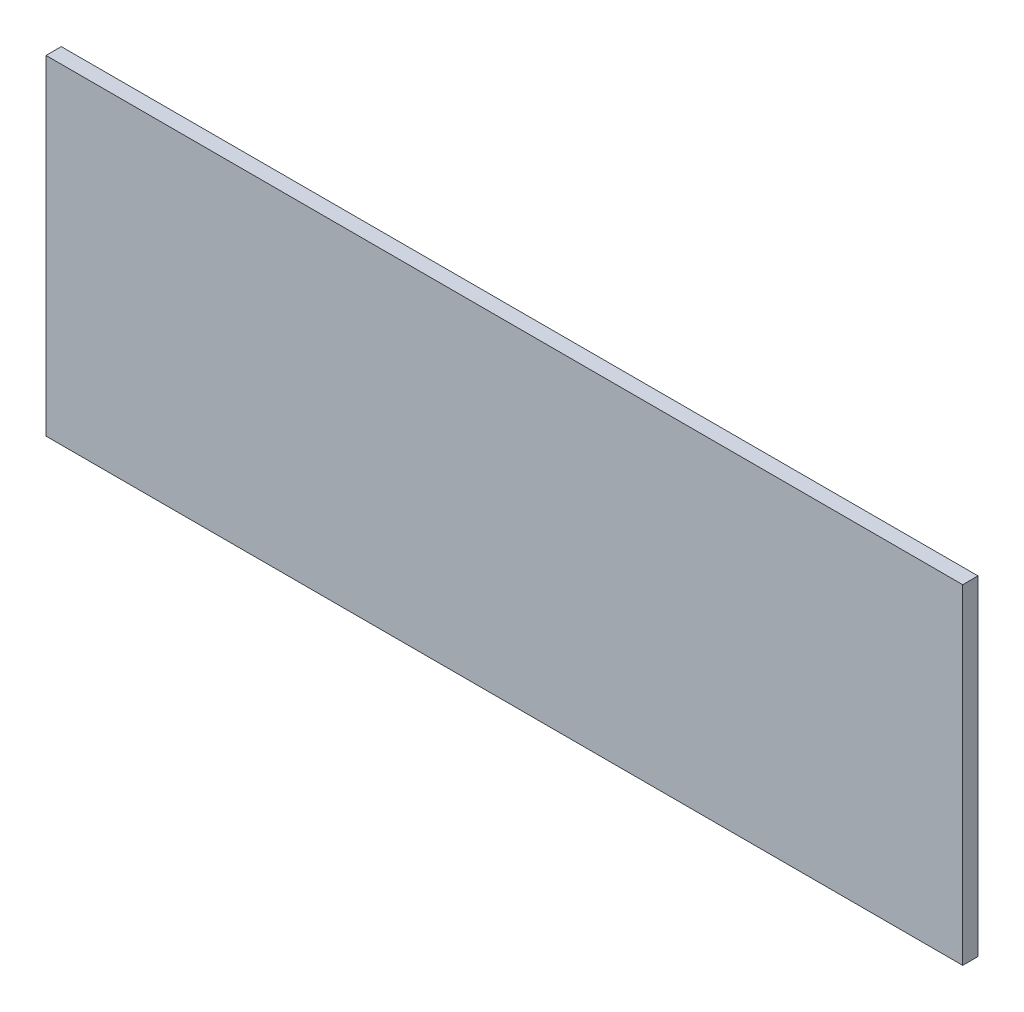
ISO-10303-21;
HEADER;
FILE_DESCRIPTION(('STEP AP214'),'2;1');
FILE_NAME('part.step','',(''),(''),'','','');
FILE_SCHEMA(('AUTOMOTIVE_DESIGN { 1 0 10303 214 1 1 1 1 }'));
ENDSEC;
DATA;
#1=APPLICATION_CONTEXT('core data for automotive mechanical design processes');
#2=APPLICATION_PROTOCOL_DEFINITION('international standard','automotive_design',2000,#1);
#3=PRODUCT_CONTEXT('',#1,'mechanical');
#4=PRODUCT('Part','Part','',(#3));
#5=PRODUCT_RELATED_PRODUCT_CATEGORY('part','',(#4));
#6=PRODUCT_DEFINITION_FORMATION('','',#4);
#7=PRODUCT_DEFINITION_CONTEXT('part definition',#1,'design');
#8=PRODUCT_DEFINITION('design','',#6,#7);
#9=PRODUCT_DEFINITION_SHAPE('','',#8);
#10=(LENGTH_UNIT() NAMED_UNIT(*) SI_UNIT(.MILLI.,.METRE.));
#11=(NAMED_UNIT(*) PLANE_ANGLE_UNIT() SI_UNIT($,.RADIAN.));
#12=(NAMED_UNIT(*) SI_UNIT($,.STERADIAN.) SOLID_ANGLE_UNIT());
#13=UNCERTAINTY_MEASURE_WITH_UNIT(LENGTH_MEASURE(1.E-05),#10,'distance_accuracy_value','');
#14=(GEOMETRIC_REPRESENTATION_CONTEXT(3) GLOBAL_UNCERTAINTY_ASSIGNED_CONTEXT((#13)) GLOBAL_UNIT_ASSIGNED_CONTEXT((#10,
#11,#12)) REPRESENTATION_CONTEXT('',''));
#15=CARTESIAN_POINT('',(0.,0.,0.));
#16=DIRECTION('',(0.,0.,1.));
#17=DIRECTION('',(1.,0.,0.));
#18=AXIS2_PLACEMENT_3D('',#15,#16,#17);
#19=CARTESIAN_POINT('',(-17.9594734246488,11.7282608695652,1.));
#20=DIRECTION('',(1.,0.,0.));
#21=DIRECTION('',(0.,0.,-1.));
#22=AXIS2_PLACEMENT_3D('',#19,#20,#21);
#23=PLANE('',#22);
#24=DIRECTION('',(0.,-1.,0.));
#25=VECTOR('',#24,1.);
#26=CARTESIAN_POINT('',(-17.9594734246488,11.7282608695652,0.));
#27=LINE('',#26,#25);
#28=CARTESIAN_POINT('',(-17.9594734246488,11.7282608695652,0.));
#29=VERTEX_POINT('',#28);
#30=CARTESIAN_POINT('',(-17.9594734246488,-9.85173913043478,0.));
#31=VERTEX_POINT('',#30);
#32=EDGE_CURVE('E96',#29,#31,#27,.T.);
#33=ORIENTED_EDGE('',*,*,#32,.T.);
#34=DIRECTION('',(0.,0.,-1.));
#35=VECTOR('',#34,1.);
#36=CARTESIAN_POINT('',(-17.9594734246488,-9.85173913043478,1.));
#37=LINE('',#36,#35);
#38=CARTESIAN_POINT('',(-17.9594734246488,-9.85173913043478,1.));
#39=VERTEX_POINT('',#38);
#40=EDGE_CURVE('E11',#39,#31,#37,.T.);
#41=ORIENTED_EDGE('',*,*,#40,.F.);
#42=DIRECTION('',(0.,-1.,0.));
#43=VECTOR('',#42,1.);
#44=CARTESIAN_POINT('',(-17.9594734246488,11.7282608695652,1.));
#45=LINE('',#44,#43);
#46=CARTESIAN_POINT('',(-17.9594734246488,11.7282608695652,1.));
#47=VERTEX_POINT('',#46);
#48=EDGE_CURVE('E84',#47,#39,#45,.T.);
#49=ORIENTED_EDGE('',*,*,#48,.F.);
#50=DIRECTION('',(0.,0.,-1.));
#51=VECTOR('',#50,1.);
#52=CARTESIAN_POINT('',(-17.9594734246488,11.7282608695652,1.));
#53=LINE('',#52,#51);
#54=EDGE_CURVE('E92',#47,#29,#53,.T.);
#55=ORIENTED_EDGE('',*,*,#54,.T.);
#56=EDGE_LOOP('',(#33,#41,#49,#55));
#57=FACE_BOUND('',#56,.T.);
#58=ADVANCED_FACE('F33',(#57),#23,.F.);
#59=CARTESIAN_POINT('',(-17.9594734246488,-9.85173913043478,1.));
#60=DIRECTION('',(0.,1.,0.));
#61=DIRECTION('',(-1.,0.,0.));
#62=AXIS2_PLACEMENT_3D('',#59,#60,#61);
#63=PLANE('',#62);
#64=DIRECTION('',(1.,0.,0.));
#65=VECTOR('',#64,1.);
#66=CARTESIAN_POINT('',(-17.9594734246488,-9.85173913043478,0.));
#67=LINE('',#66,#65);
#68=CARTESIAN_POINT('',(42.0405265753512,-9.85173913043478,0.));
#69=VERTEX_POINT('',#68);
#70=EDGE_CURVE('E88',#31,#69,#67,.T.);
#71=ORIENTED_EDGE('',*,*,#70,.T.);
#72=DIRECTION('',(0.,0.,-1.));
#73=VECTOR('',#72,1.);
#74=CARTESIAN_POINT('',(42.0405265753512,-9.85173913043478,1.));
#75=LINE('',#74,#73);
#76=CARTESIAN_POINT('',(42.0405265753512,-9.85173913043478,1.));
#77=VERTEX_POINT('',#76);
#78=EDGE_CURVE('E41',#77,#69,#75,.T.);
#79=ORIENTED_EDGE('',*,*,#78,.F.);
#80=DIRECTION('',(1.,0.,0.));
#81=VECTOR('',#80,1.);
#82=CARTESIAN_POINT('',(-17.9594734246488,-9.85173913043478,1.));
#83=LINE('',#82,#81);
#84=EDGE_CURVE('E79',#39,#77,#83,.T.);
#85=ORIENTED_EDGE('',*,*,#84,.F.);
#86=ORIENTED_EDGE('',*,*,#40,.T.);
#87=EDGE_LOOP('',(#71,#79,#85,#86));
#88=FACE_BOUND('',#87,.T.);
#89=ADVANCED_FACE('F87',(#88),#63,.F.);
#90=CARTESIAN_POINT('',(42.0405265753512,11.7282608695652,1.));
#91=DIRECTION('',(-1.,0.,0.));
#92=DIRECTION('',(0.,0.,1.));
#93=AXIS2_PLACEMENT_3D('',#90,#91,#92);
#94=PLANE('',#93);
#95=DIRECTION('',(0.,1.,0.));
#96=VECTOR('',#95,1.);
#97=CARTESIAN_POINT('',(42.0405265753512,11.7282608695652,0.));
#98=LINE('',#97,#96);
#99=CARTESIAN_POINT('',(42.0405265753512,11.7282608695652,0.));
#100=VERTEX_POINT('',#99);
#101=EDGE_CURVE('E66',#69,#100,#98,.T.);
#102=ORIENTED_EDGE('',*,*,#101,.T.);
#103=DIRECTION('',(0.,0.,-1.));
#104=VECTOR('',#103,1.);
#105=CARTESIAN_POINT('',(42.0405265753512,11.7282608695652,1.));
#106=LINE('',#105,#104);
#107=CARTESIAN_POINT('',(42.0405265753512,11.7282608695652,1.));
#108=VERTEX_POINT('',#107);
#109=EDGE_CURVE('E89',#108,#100,#106,.T.);
#110=ORIENTED_EDGE('',*,*,#109,.F.);
#111=DIRECTION('',(0.,1.,0.));
#112=VECTOR('',#111,1.);
#113=CARTESIAN_POINT('',(42.0405265753512,11.7282608695652,1.));
#114=LINE('',#113,#112);
#115=EDGE_CURVE('E82',#77,#108,#114,.T.);
#116=ORIENTED_EDGE('',*,*,#115,.F.);
#117=ORIENTED_EDGE('',*,*,#78,.T.);
#118=EDGE_LOOP('',(#102,#110,#116,#117));
#119=FACE_BOUND('',#118,.T.);
#120=ADVANCED_FACE('F90',(#119),#94,.F.);
#121=CARTESIAN_POINT('',(-17.9594734246488,11.7282608695652,1.));
#122=DIRECTION('',(0.,-1.,0.));
#123=DIRECTION('',(0.,0.,-1.));
#124=AXIS2_PLACEMENT_3D('',#121,#122,#123);
#125=PLANE('',#124);
#126=DIRECTION('',(-1.,0.,0.));
#127=VECTOR('',#126,1.);
#128=CARTESIAN_POINT('',(-17.9594734246488,11.7282608695652,0.));
#129=LINE('',#128,#127);
#130=EDGE_CURVE('E72',#100,#29,#129,.T.);
#131=ORIENTED_EDGE('',*,*,#130,.T.);
#132=ORIENTED_EDGE('',*,*,#54,.F.);
#133=DIRECTION('',(-1.,0.,0.));
#134=VECTOR('',#133,1.);
#135=CARTESIAN_POINT('',(-17.9594734246488,11.7282608695652,1.));
#136=LINE('',#135,#134);
#137=EDGE_CURVE('E49',#108,#47,#136,.T.);
#138=ORIENTED_EDGE('',*,*,#137,.F.);
#139=ORIENTED_EDGE('',*,*,#109,.T.);
#140=EDGE_LOOP('',(#131,#132,#138,#139));
#141=FACE_BOUND('',#140,.T.);
#142=ADVANCED_FACE('F103',(#141),#125,.F.);
#143=CARTESIAN_POINT('',(0.,0.,1.));
#144=DIRECTION('',(0.,0.,1.));
#145=DIRECTION('',(1.,0.,0.));
#146=AXIS2_PLACEMENT_3D('',#143,#144,#145);
#147=PLANE('',#146);
#148=ORIENTED_EDGE('',*,*,#48,.T.);
#149=ORIENTED_EDGE('',*,*,#84,.T.);
#150=ORIENTED_EDGE('',*,*,#115,.T.);
#151=ORIENTED_EDGE('',*,*,#137,.T.);
#152=EDGE_LOOP('',(#148,#149,#150,#151));
#153=FACE_BOUND('',#152,.T.);
#154=ADVANCED_FACE('F80',(#153),#147,.T.);
#155=CARTESIAN_POINT('',(0.,0.,0.));
#156=DIRECTION('',(0.,0.,1.));
#157=DIRECTION('',(1.,0.,0.));
#158=AXIS2_PLACEMENT_3D('',#155,#156,#157);
#159=PLANE('',#158);
#160=ORIENTED_EDGE('',*,*,#32,.F.);
#161=ORIENTED_EDGE('',*,*,#130,.F.);
#162=ORIENTED_EDGE('',*,*,#101,.F.);
#163=ORIENTED_EDGE('',*,*,#70,.F.);
#164=EDGE_LOOP('',(#160,#161,#162,#163));
#165=FACE_BOUND('',#164,.T.);
#166=ADVANCED_FACE('F106',(#165),#159,.F.);
#167=CLOSED_SHELL('',(#58,#89,#120,#142,#154,#166));
#168=MANIFOLD_SOLID_BREP('B2',#167);
#169=ADVANCED_BREP_SHAPE_REPRESENTATION('',(#18,#168),#14);
#170=SHAPE_DEFINITION_REPRESENTATION(#9,#169);
ENDSEC;
END-ISO-10303-21;
